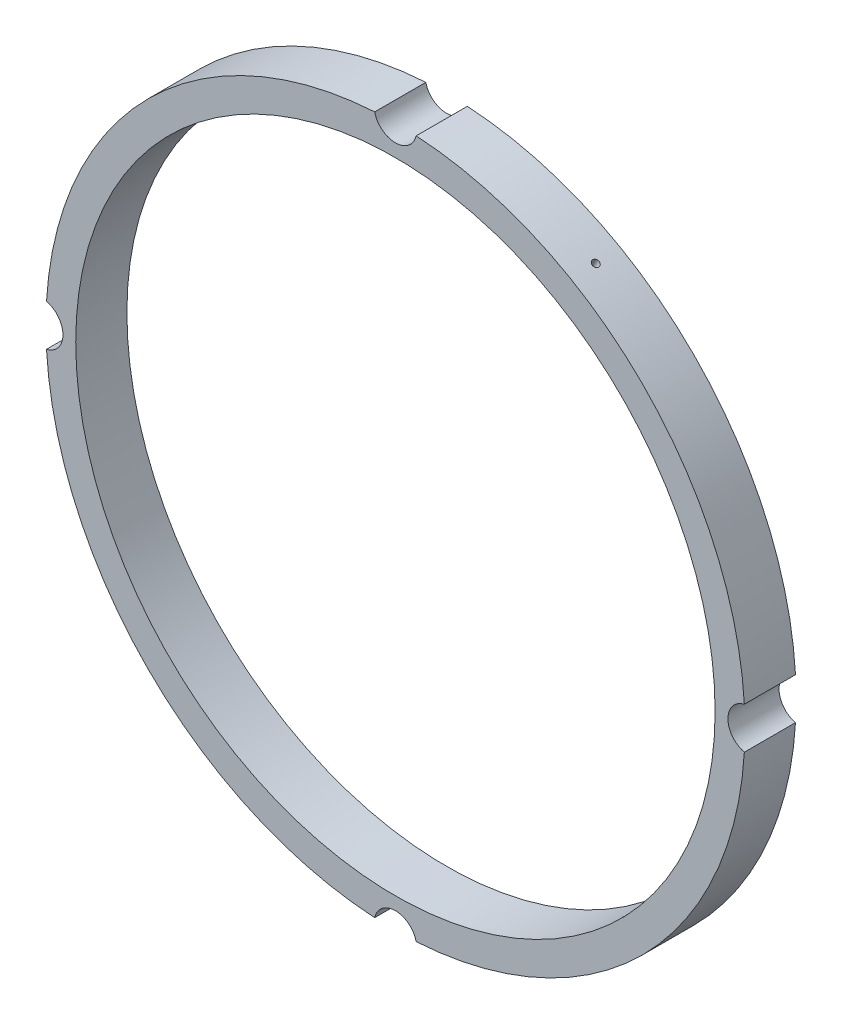
ISO-10303-21;
HEADER;
FILE_DESCRIPTION(('STEP AP214'),'2;1');
FILE_NAME('part.step','',(''),(''),'','','');
FILE_SCHEMA(('AUTOMOTIVE_DESIGN { 1 0 10303 214 1 1 1 1 }'));
ENDSEC;
DATA;
#1=APPLICATION_CONTEXT('core data for automotive mechanical design processes');
#2=APPLICATION_PROTOCOL_DEFINITION('international standard','automotive_design',2000,#1);
#3=PRODUCT_CONTEXT('',#1,'mechanical');
#4=PRODUCT('Part','Part','',(#3));
#5=PRODUCT_RELATED_PRODUCT_CATEGORY('part','',(#4));
#6=PRODUCT_DEFINITION_FORMATION('','',#4);
#7=PRODUCT_DEFINITION_CONTEXT('part definition',#1,'design');
#8=PRODUCT_DEFINITION('design','',#6,#7);
#9=PRODUCT_DEFINITION_SHAPE('','',#8);
#10=(LENGTH_UNIT() NAMED_UNIT(*) SI_UNIT(.MILLI.,.METRE.));
#11=(NAMED_UNIT(*) PLANE_ANGLE_UNIT() SI_UNIT($,.RADIAN.));
#12=(NAMED_UNIT(*) SI_UNIT($,.STERADIAN.) SOLID_ANGLE_UNIT());
#13=UNCERTAINTY_MEASURE_WITH_UNIT(LENGTH_MEASURE(1.E-05),#10,'distance_accuracy_value','');
#14=(GEOMETRIC_REPRESENTATION_CONTEXT(3) GLOBAL_UNCERTAINTY_ASSIGNED_CONTEXT((#13)) GLOBAL_UNIT_ASSIGNED_CONTEXT((#10,
#11,#12)) REPRESENTATION_CONTEXT('',''));
#15=CARTESIAN_POINT('',(0.,0.,0.));
#16=DIRECTION('',(0.,0.,1.));
#17=DIRECTION('',(1.,0.,0.));
#18=AXIS2_PLACEMENT_3D('',#15,#16,#17);
#19=CARTESIAN_POINT('',(0.,0.,12.));
#20=DIRECTION('',(0.,0.,-1.));
#21=DIRECTION('',(-1.,0.,0.));
#22=AXIS2_PLACEMENT_3D('',#19,#20,#21);
#23=CYLINDRICAL_SURFACE('',#22,82.);
#24=CARTESIAN_POINT('',(0.,0.,0.));
#25=DIRECTION('',(0.,0.,1.));
#26=DIRECTION('',(1.,0.,0.));
#27=AXIS2_PLACEMENT_3D('',#24,#25,#26);
#28=CIRCLE('',#27,82.);
#29=CARTESIAN_POINT('',(-4.86723129559619,81.855421686747,0.));
#30=VERTEX_POINT('',#29);
#31=CARTESIAN_POINT('',(-81.8554216867469,4.86723129559705,0.));
#32=VERTEX_POINT('',#31);
#33=EDGE_CURVE('E123',#30,#32,#28,.T.);
#34=ORIENTED_EDGE('',*,*,#33,.T.);
#35=DIRECTION('',(0.,0.,1.));
#36=VECTOR('',#35,1.);
#37=CARTESIAN_POINT('',(-81.8554216867469,4.86723129559704,6.));
#38=LINE('',#37,#36);
#39=CARTESIAN_POINT('',(-81.8554216867469,4.86723129559704,12.));
#40=VERTEX_POINT('',#39);
#41=EDGE_CURVE('E56',#32,#40,#38,.T.);
#42=ORIENTED_EDGE('',*,*,#41,.T.);
#43=CARTESIAN_POINT('',(0.,0.,12.));
#44=DIRECTION('',(0.,0.,1.));
#45=DIRECTION('',(1.,0.,0.));
#46=AXIS2_PLACEMENT_3D('',#43,#44,#45);
#47=CIRCLE('',#46,82.);
#48=CARTESIAN_POINT('',(-4.86723129559619,81.855421686747,12.));
#49=VERTEX_POINT('',#48);
#50=EDGE_CURVE('E130',#49,#40,#47,.T.);
#51=ORIENTED_EDGE('',*,*,#50,.F.);
#52=DIRECTION('',(0.,0.,1.));
#53=VECTOR('',#52,1.);
#54=CARTESIAN_POINT('',(-4.86723129559619,81.855421686747,6.));
#55=LINE('',#54,#53);
#56=EDGE_CURVE('E132',#49,#30,#55,.F.);
#57=ORIENTED_EDGE('',*,*,#56,.T.);
#58=EDGE_LOOP('',(#34,#42,#51,#57));
#59=FACE_BOUND('',#58,.T.);
#60=ADVANCED_FACE('F37',(#59),#23,.T.);
#61=CARTESIAN_POINT('',(-81.8554216867471,-4.86723129559533,12.));
#62=VERTEX_POINT('',#61);
#63=CARTESIAN_POINT('',(-4.86723129559619,-81.855421686747,12.));
#64=VERTEX_POINT('',#63);
#65=EDGE_CURVE('E116',#62,#64,#47,.T.);
#66=ORIENTED_EDGE('',*,*,#65,.F.);
#67=DIRECTION('',(0.,0.,1.));
#68=VECTOR('',#67,1.);
#69=CARTESIAN_POINT('',(-81.8554216867471,-4.86723129559533,6.));
#70=LINE('',#69,#68);
#71=CARTESIAN_POINT('',(-81.8554216867471,-4.86723129559533,0.));
#72=VERTEX_POINT('',#71);
#73=EDGE_CURVE('E107',#62,#72,#70,.F.);
#74=ORIENTED_EDGE('',*,*,#73,.T.);
#75=CARTESIAN_POINT('',(-4.86723129559619,-81.855421686747,0.));
#76=VERTEX_POINT('',#75);
#77=EDGE_CURVE('E64',#72,#76,#28,.T.);
#78=ORIENTED_EDGE('',*,*,#77,.T.);
#79=DIRECTION('',(0.,0.,1.));
#80=VECTOR('',#79,1.);
#81=CARTESIAN_POINT('',(-4.86723129559619,-81.855421686747,6.));
#82=LINE('',#81,#80);
#83=EDGE_CURVE('E161',#76,#64,#82,.T.);
#84=ORIENTED_EDGE('',*,*,#83,.T.);
#85=EDGE_LOOP('',(#66,#74,#78,#84));
#86=FACE_BOUND('',#85,.T.);
#87=ADVANCED_FACE('F115',(#86),#23,.T.);
#88=CARTESIAN_POINT('',(4.86723129559619,-81.855421686747,12.));
#89=VERTEX_POINT('',#88);
#90=CARTESIAN_POINT('',(81.855421686747,-4.86723129559647,12.));
#91=VERTEX_POINT('',#90);
#92=EDGE_CURVE('E146',#89,#91,#47,.T.);
#93=ORIENTED_EDGE('',*,*,#92,.F.);
#94=DIRECTION('',(0.,0.,1.));
#95=VECTOR('',#94,1.);
#96=CARTESIAN_POINT('',(4.86723129559619,-81.855421686747,6.));
#97=LINE('',#96,#95);
#98=CARTESIAN_POINT('',(4.86723129559619,-81.855421686747,0.));
#99=VERTEX_POINT('',#98);
#100=EDGE_CURVE('E214',#89,#99,#97,.F.);
#101=ORIENTED_EDGE('',*,*,#100,.T.);
#102=CARTESIAN_POINT('',(81.855421686747,-4.86723129559647,0.));
#103=VERTEX_POINT('',#102);
#104=EDGE_CURVE('E124',#99,#103,#28,.T.);
#105=ORIENTED_EDGE('',*,*,#104,.T.);
#106=DIRECTION('',(0.,0.,1.));
#107=VECTOR('',#106,1.);
#108=CARTESIAN_POINT('',(81.855421686747,-4.86723129559647,6.));
#109=LINE('',#108,#107);
#110=EDGE_CURVE('E49',#103,#91,#109,.T.);
#111=ORIENTED_EDGE('',*,*,#110,.T.);
#112=EDGE_LOOP('',(#93,#101,#105,#111));
#113=FACE_BOUND('',#112,.T.);
#114=ADVANCED_FACE('F144',(#113),#23,.T.);
#115=CARTESIAN_POINT('',(0.,0.,12.));
#116=DIRECTION('',(0.,0.,1.));
#117=DIRECTION('',(1.,0.,0.));
#118=AXIS2_PLACEMENT_3D('',#115,#116,#117);
#119=PLANE('',#118);
#120=CARTESIAN_POINT('',(-83.,8.6937885337194E-13,12.));
#121=DIRECTION('',(0.,0.,1.));
#122=DIRECTION('',(0.,1.,0.));
#123=AXIS2_PLACEMENT_3D('',#120,#121,#122);
#124=CIRCLE('',#123,5.);
#125=EDGE_CURVE('E112',#62,#40,#124,.T.);
#126=ORIENTED_EDGE('',*,*,#125,.F.);
#127=ORIENTED_EDGE('',*,*,#65,.T.);
#128=CARTESIAN_POINT('',(0.,-83.,12.));
#129=DIRECTION('',(0.,0.,1.));
#130=DIRECTION('',(-1.,0.,0.));
#131=AXIS2_PLACEMENT_3D('',#128,#129,#130);
#132=CIRCLE('',#131,5.);
#133=EDGE_CURVE('E206',#89,#64,#132,.T.);
#134=ORIENTED_EDGE('',*,*,#133,.F.);
#135=ORIENTED_EDGE('',*,*,#92,.T.);
#136=CARTESIAN_POINT('',(83.,-2.8979295112398E-13,12.));
#137=DIRECTION('',(0.,0.,1.));
#138=DIRECTION('',(0.,-1.,0.));
#139=AXIS2_PLACEMENT_3D('',#136,#137,#138);
#140=CIRCLE('',#139,5.);
#141=CARTESIAN_POINT('',(81.855421686747,4.8672312955959,12.));
#142=VERTEX_POINT('',#141);
#143=EDGE_CURVE('E153',#142,#91,#140,.T.);
#144=ORIENTED_EDGE('',*,*,#143,.F.);
#145=CARTESIAN_POINT('',(4.86723129559619,81.855421686747,12.));
#146=VERTEX_POINT('',#145);
#147=EDGE_CURVE('E126',#142,#146,#47,.T.);
#148=ORIENTED_EDGE('',*,*,#147,.T.);
#149=CARTESIAN_POINT('',(0.,83.,12.));
#150=DIRECTION('',(0.,0.,1.));
#151=DIRECTION('',(1.,0.,0.));
#152=AXIS2_PLACEMENT_3D('',#149,#150,#151);
#153=CIRCLE('',#152,5.);
#154=EDGE_CURVE('E156',#49,#146,#153,.T.);
#155=ORIENTED_EDGE('',*,*,#154,.F.);
#156=ORIENTED_EDGE('',*,*,#50,.T.);
#157=EDGE_LOOP('',(#126,#127,#134,#135,#144,#148,#155,#156));
#158=FACE_BOUND('',#157,.T.);
#159=CARTESIAN_POINT('',(0.,0.,12.));
#160=DIRECTION('',(0.,0.,1.));
#161=DIRECTION('',(1.,0.,0.));
#162=AXIS2_PLACEMENT_3D('',#159,#160,#161);
#163=CIRCLE('',#162,75.);
#164=CARTESIAN_POINT('',(75.,0.,12.));
#165=VERTEX_POINT('',#164);
#166=EDGE_CURVE('E168',#165,#165,#163,.T.);
#167=ORIENTED_EDGE('',*,*,#166,.F.);
#168=EDGE_LOOP('',(#167));
#169=FACE_BOUND('',#168,.T.);
#170=ADVANCED_FACE('F202',(#158,#169),#119,.T.);
#171=CARTESIAN_POINT('',(0.,0.,0.));
#172=DIRECTION('',(0.,0.,1.));
#173=DIRECTION('',(1.,0.,0.));
#174=AXIS2_PLACEMENT_3D('',#171,#172,#173);
#175=PLANE('',#174);
#176=ORIENTED_EDGE('',*,*,#77,.F.);
#177=CARTESIAN_POINT('',(-83.,8.6937885337194E-13,0.));
#178=DIRECTION('',(0.,0.,1.));
#179=DIRECTION('',(0.,1.,0.));
#180=AXIS2_PLACEMENT_3D('',#177,#178,#179);
#181=CIRCLE('',#180,5.);
#182=EDGE_CURVE('E105',#72,#32,#181,.T.);
#183=ORIENTED_EDGE('',*,*,#182,.T.);
#184=ORIENTED_EDGE('',*,*,#33,.F.);
#185=CARTESIAN_POINT('',(0.,83.,0.));
#186=DIRECTION('',(0.,0.,1.));
#187=DIRECTION('',(1.,0.,0.));
#188=AXIS2_PLACEMENT_3D('',#185,#186,#187);
#189=CIRCLE('',#188,5.);
#190=CARTESIAN_POINT('',(4.86723129559619,81.855421686747,0.));
#191=VERTEX_POINT('',#190);
#192=EDGE_CURVE('E159',#30,#191,#189,.T.);
#193=ORIENTED_EDGE('',*,*,#192,.T.);
#194=CARTESIAN_POINT('',(81.855421686747,4.8672312955959,0.));
#195=VERTEX_POINT('',#194);
#196=EDGE_CURVE('E127',#195,#191,#28,.T.);
#197=ORIENTED_EDGE('',*,*,#196,.F.);
#198=CARTESIAN_POINT('',(83.,-2.8979295112398E-13,0.));
#199=DIRECTION('',(0.,0.,1.));
#200=DIRECTION('',(0.,-1.,0.));
#201=AXIS2_PLACEMENT_3D('',#198,#199,#200);
#202=CIRCLE('',#201,5.);
#203=EDGE_CURVE('E151',#195,#103,#202,.T.);
#204=ORIENTED_EDGE('',*,*,#203,.T.);
#205=ORIENTED_EDGE('',*,*,#104,.F.);
#206=CARTESIAN_POINT('',(0.,-83.,0.));
#207=DIRECTION('',(0.,0.,1.));
#208=DIRECTION('',(-1.,0.,0.));
#209=AXIS2_PLACEMENT_3D('',#206,#207,#208);
#210=CIRCLE('',#209,5.);
#211=EDGE_CURVE('E122',#99,#76,#210,.T.);
#212=ORIENTED_EDGE('',*,*,#211,.T.);
#213=EDGE_LOOP('',(#176,#183,#184,#193,#197,#204,#205,#212));
#214=FACE_BOUND('',#213,.T.);
#215=CARTESIAN_POINT('',(0.,0.,0.));
#216=DIRECTION('',(0.,0.,1.));
#217=DIRECTION('',(1.,0.,0.));
#218=AXIS2_PLACEMENT_3D('',#215,#216,#217);
#219=CIRCLE('',#218,75.);
#220=CARTESIAN_POINT('',(75.,0.,0.));
#221=VERTEX_POINT('',#220);
#222=EDGE_CURVE('E166',#221,#221,#219,.T.);
#223=ORIENTED_EDGE('',*,*,#222,.T.);
#224=EDGE_LOOP('',(#223));
#225=FACE_BOUND('',#224,.T.);
#226=ADVANCED_FACE('F119',(#214,#225),#175,.F.);
#227=CARTESIAN_POINT('',(40.3052284110281,71.4107034185693,6.));
#228=CARTESIAN_POINT('',(40.305230162785,71.4107024681233,5.95506479609301));
#229=CARTESIAN_POINT('',(40.3085368078791,71.40883642493,5.91009703714875));
#230=CARTESIAN_POINT('',(40.3216802135916,71.4014156688339,5.82140003350558));
#231=CARTESIAN_POINT('',(40.3315248278901,71.3958565196163,5.7776723443821));
#232=CARTESIAN_POINT('',(40.3574592527584,71.3811999286591,5.69275330768963));
#233=CARTESIAN_POINT('',(40.3735460727166,71.3721041812829,5.65156075648079));
#234=CARTESIAN_POINT('',(40.4114971299767,71.3506227921757,5.57287429083479));
#235=CARTESIAN_POINT('',(40.4333599334488,71.3382379669211,5.53537946164327));
#236=CARTESIAN_POINT('',(40.4822388609424,71.3105120161913,5.4651344354136));
#237=CARTESIAN_POINT('',(40.5092556770344,71.2951704936937,5.43238487660122));
#238=CARTESIAN_POINT('',(40.5676657214676,71.2619507473826,5.37256517048709));
#239=CARTESIAN_POINT('',(40.59905912185,71.2440724238483,5.34549524655357));
#240=CARTESIAN_POINT('',(40.6653214679689,71.2062713712898,5.29780471692709));
#241=CARTESIAN_POINT('',(40.7001904182244,71.1863486396075,5.27718411961991));
#242=CARTESIAN_POINT('',(40.772406334745,71.1450111456782,5.24297779787522));
#243=CARTESIAN_POINT('',(40.8097532955037,71.1235963867468,5.22939205780614));
#244=CARTESIAN_POINT('',(40.8858585322044,71.0798740635081,5.20964144378451));
#245=CARTESIAN_POINT('',(40.9246167652487,71.0575665263361,5.20347634446412));
#246=CARTESIAN_POINT('',(41.0024427076472,71.0126869615936,5.19874133559804));
#247=CARTESIAN_POINT('',(41.0415104163721,70.9901149345609,5.20017141060814));
#248=CARTESIAN_POINT('',(41.1188455717403,70.945348935138,5.21058592631372));
#249=CARTESIAN_POINT('',(41.1571130452983,70.9231549500377,5.21957011251892));
#250=CARTESIAN_POINT('',(41.2317665366884,70.8797805669154,5.2448374350582));
#251=CARTESIAN_POINT('',(41.2681525523058,70.8586001700864,5.26112057998316));
#252=CARTESIAN_POINT('',(41.3380172194721,70.8178647619419,5.30052388209611));
#253=CARTESIAN_POINT('',(41.3714958216182,70.7983097782456,5.32364415543103));
#254=CARTESIAN_POINT('',(41.434603016724,70.7613949232539,5.37606530348475));
#255=CARTESIAN_POINT('',(41.4642316101463,70.7440350516948,5.40536617746084));
#256=CARTESIAN_POINT('',(41.5188083007378,70.7120185025764,5.4693182281911));
#257=CARTESIAN_POINT('',(41.5437562021976,70.6973619380483,5.50396962855131));
#258=CARTESIAN_POINT('',(41.5882710512857,70.6711849340483,5.57763829735254));
#259=CARTESIAN_POINT('',(41.6078379981956,70.6596644949952,5.61665556637643));
#260=CARTESIAN_POINT('',(41.641043626485,70.640100926749,5.69794850712354));
#261=CARTESIAN_POINT('',(41.6546823022913,70.6320578008251,5.74022418191001));
#262=CARTESIAN_POINT('',(41.6756502729947,70.6196879331484,5.8268337992777));
#263=CARTESIAN_POINT('',(41.6829795699621,70.6153611901761,5.87116774118355));
#264=CARTESIAN_POINT('',(41.6911239668386,70.6105530728755,5.96063342804992));
#265=CARTESIAN_POINT('',(41.6919393353669,70.6100715399797,6.00576514003536));
#266=CARTESIAN_POINT('',(41.6870338226723,70.6129677812092,6.09554693556317));
#267=CARTESIAN_POINT('',(41.6813129419862,70.6163455550177,6.14019701914508));
#268=CARTESIAN_POINT('',(41.6634948178797,70.6268596602105,6.22774720890134));
#269=CARTESIAN_POINT('',(41.6513976958952,70.6339959200141,6.27064734838672));
#270=CARTESIAN_POINT('',(41.6211650638207,70.6518147314161,6.3534808607507));
#271=CARTESIAN_POINT('',(41.6030295531477,70.6624972833568,6.39341423334282));
#272=CARTESIAN_POINT('',(41.5612265203059,70.6870924286367,6.469182062557));
#273=CARTESIAN_POINT('',(41.537558817141,70.7010051276562,6.50501638501377));
#274=CARTESIAN_POINT('',(41.4853544455829,70.7316497769729,6.57156755198845));
#275=CARTESIAN_POINT('',(41.4568177741148,70.7483817290505,6.60228439327472));
#276=CARTESIAN_POINT('',(41.3956750206665,70.7841743762166,6.65772966893016));
#277=CARTESIAN_POINT('',(41.3630688010143,70.8032351500882,6.68245790062276));
#278=CARTESIAN_POINT('',(41.2947046718655,70.8431290267123,6.72522259144113));
#279=CARTESIAN_POINT('',(41.2589467660966,70.8639621273686,6.74325905848161));
#280=CARTESIAN_POINT('',(41.1852880913143,70.9067969831621,6.77212789441348));
#281=CARTESIAN_POINT('',(41.1473873619883,70.9287987166545,6.7829603966825));
#282=CARTESIAN_POINT('',(41.0705139344065,70.9733390629306,6.79711425167829));
#283=CARTESIAN_POINT('',(41.0315412345227,70.9958776765296,6.80043559299621));
#284=CARTESIAN_POINT('',(40.9536306752187,71.0408485140235,6.79947279646204));
#285=CARTESIAN_POINT('',(40.9146928143604,71.0632807424909,6.7951889885238));
#286=CARTESIAN_POINT('',(40.8379572703114,71.1074061241529,6.779138152379));
#287=CARTESIAN_POINT('',(40.8001595894107,71.129099275863,6.76737110914375));
#288=CARTESIAN_POINT('',(40.7267814451327,71.1711392536284,6.73668763250792));
#289=CARTESIAN_POINT('',(40.6912010228659,71.1914860547211,6.71777106659268));
#290=CARTESIAN_POINT('',(40.6232765406942,71.2302669838026,6.67332635454546));
#291=CARTESIAN_POINT('',(40.5909323548439,71.2487011862253,6.6477984658466));
#292=CARTESIAN_POINT('',(40.5304074104666,71.2831487094411,6.59085755066491));
#293=CARTESIAN_POINT('',(40.5022263893502,71.2991621829217,6.55944489564428));
#294=CARTESIAN_POINT('',(40.4508278504761,71.328335198352,6.49161477008843));
#295=CARTESIAN_POINT('',(40.4276115676375,71.3414940302556,6.45519605804873));
#296=CARTESIAN_POINT('',(40.3868099222115,71.3646000206399,6.37838044791628));
#297=CARTESIAN_POINT('',(40.3692273551643,71.3745455846659,6.33798158776967));
#298=CARTESIAN_POINT('',(40.340231691055,71.3909377104108,6.25439747070503));
#299=CARTESIAN_POINT('',(40.3288112020707,71.3973884644812,6.21121562216788));
#300=CARTESIAN_POINT('',(40.3155112248783,71.4048988976244,6.13979902324665));
#301=CARTESIAN_POINT('',(40.3116600520628,71.4070729879977,6.11202827082364));
#302=CARTESIAN_POINT('',(40.3065180975612,71.4099755455663,6.05617592082972));
#303=CARTESIAN_POINT('',(40.3052273157971,71.4107040128057,6.02809432326828));
#304=CARTESIAN_POINT('',(40.3052284110281,71.4107034185693,6.));
#305=B_SPLINE_CURVE_WITH_KNOTS('',3,(#227,#228,#229,#230,#231,#232,#233,#234,#235,#236,#237,
#238,#239,#240,#241,#242,#243,#244,#245,#246,#247,#248,#249,#250,#251,#252,#253,#254,#255,#256,
#257,#258,#259,#260,#261,#262,#263,#264,#265,#266,#267,#268,#269,#270,#271,#272,#273,#274,#275,
#276,#277,#278,#279,#280,#281,#282,#283,#284,#285,#286,#287,#288,#289,#290,#291,#292,#293,#294,
#295,#296,#297,#298,#299,#300,#301,#302,#303,#304),.UNSPECIFIED.,.T.,.F.,(4,2,2,2,2,2,2,2,2,2,2,
2,2,2,2,2,2,2,2,2,2,2,2,2,2,2,2,2,2,2,2,2,2,2,2,2,2,2,4),(0.,0.134703067123951,
0.269568238553242,0.404368876326957,0.539136082591843,0.673921397882172,0.808712013005293,
0.943502803389999,1.07829329426615,1.21307969139774,1.3478658144514,1.4826473968801,
1.61742913794745,1.75221316877516,1.88699718340582,2.02178683237555,2.15657649934034,
2.29136629302324,2.426156042478,2.56094023348925,2.69572441343266,2.83050602649563,
2.96528765257389,3.10007368890393,3.23485981034963,3.36965049281603,3.50444101585779,
3.639229043254,3.77401727538222,3.90879966049609,4.04358231629638,4.1783674703827,
4.31314737696436,4.44791877874285,4.58272366439784,4.71759533917825,4.85230486249334,
4.93652372208243,5.02074257910246),.UNSPECIFIED.);
#306=CARTESIAN_POINT('',(40.3052284110281,71.4107034185693,6.));
#307=VERTEX_POINT('',#306);
#308=EDGE_CURVE('E11',#307,#307,#305,.T.);
#309=ORIENTED_EDGE('',*,*,#308,.T.);
#310=EDGE_LOOP('',(#309));
#311=FACE_BOUND('',#310,.T.);
#312=ORIENTED_EDGE('',*,*,#147,.F.);
#313=DIRECTION('',(0.,0.,1.));
#314=VECTOR('',#313,1.);
#315=CARTESIAN_POINT('',(81.855421686747,4.8672312955959,6.));
#316=LINE('',#315,#314);
#317=EDGE_CURVE('E138',#142,#195,#316,.F.);
#318=ORIENTED_EDGE('',*,*,#317,.T.);
#319=ORIENTED_EDGE('',*,*,#196,.T.);
#320=DIRECTION('',(0.,0.,1.));
#321=VECTOR('',#320,1.);
#322=CARTESIAN_POINT('',(4.86723129559619,81.855421686747,6.));
#323=LINE('',#322,#321);
#324=EDGE_CURVE('E135',#191,#146,#323,.T.);
#325=ORIENTED_EDGE('',*,*,#324,.T.);
#326=EDGE_LOOP('',(#312,#318,#319,#325));
#327=FACE_BOUND('',#326,.T.);
#328=ADVANCED_FACE('F39',(#311,#327),#23,.T.);
#329=CARTESIAN_POINT('',(0.,0.,12.));
#330=DIRECTION('',(0.,0.,-1.));
#331=DIRECTION('',(-1.,0.,0.));
#332=AXIS2_PLACEMENT_3D('',#329,#330,#331);
#333=CYLINDRICAL_SURFACE('',#332,75.);
#334=CARTESIAN_POINT('',(36.8050462829542,65.3482101370007,6.));
#335=CARTESIAN_POINT('',(36.8050480371068,65.3482091908556,5.9550650202504));
#336=CARTESIAN_POINT('',(36.8083563893281,65.3463461799556,5.91009749094246));
#337=CARTESIAN_POINT('',(36.8215064307599,65.3389372344705,5.82140095562176));
#338=CARTESIAN_POINT('',(36.8313559762903,65.3333868711768,5.77767350494019));
#339=CARTESIAN_POINT('',(36.8573029001601,65.3187526175866,5.69275494634586));
#340=CARTESIAN_POINT('',(36.8733972851322,65.3096704202157,5.65156263419737));
#341=CARTESIAN_POINT('',(36.9113652327449,65.2882193796654,5.57287659923403));
#342=CARTESIAN_POINT('',(36.9332373616623,65.275851351847,5.535381962022));
#343=CARTESIAN_POINT('',(36.9821357786632,65.2481602840425,5.46513702906338));
#344=CARTESIAN_POINT('',(37.0091627888349,65.2328368300614,5.43238739912278));
#345=CARTESIAN_POINT('',(37.0675928290538,65.1996525164563,5.37256749931847));
#346=CARTESIAN_POINT('',(37.0989960311762,65.1817915570551,5.34549745288538));
#347=CARTESIAN_POINT('',(37.165276621277,65.1440224914367,5.29780653018475));
#348=CARTESIAN_POINT('',(37.2001540272983,65.1241143745878,5.27718568741294));
#349=CARTESIAN_POINT('',(37.2723844475244,65.0828017747338,5.24297889347224));
#350=CARTESIAN_POINT('',(37.309737456126,65.0613972951156,5.22939292638149));
#351=CARTESIAN_POINT('',(37.3858514560471,65.0176901750221,5.20964196631049));
#352=CARTESIAN_POINT('',(37.4246123956757,64.9953875675174,5.20347670116969));
#353=CARTESIAN_POINT('',(37.5024403148383,64.9505118372576,5.19874132894007));
#354=CARTESIAN_POINT('',(37.541507293736,64.9279387150649,5.20017120606366));
#355=CARTESIAN_POINT('',(37.6188373554943,64.8831647861721,5.21058526118988));
#356=CARTESIAN_POINT('',(37.6571004707224,64.8609639644887,5.21956913443268));
#357=CARTESIAN_POINT('',(37.7317423544195,64.8175707954564,5.24483569725782));
#358=CARTESIAN_POINT('',(37.7681211206258,64.7963784493184,5.26111839560382));
#359=CARTESIAN_POINT('',(37.8379693340923,64.7556153066755,5.3005207415664));
#360=CARTESIAN_POINT('',(37.8714387220741,64.7360445432105,5.32364052844561));
#361=CARTESIAN_POINT('',(37.934526459754,64.6990961367939,5.3760606377374));
#362=CARTESIAN_POINT('',(37.9641448097006,64.6817184937006,5.40536095975093));
#363=CARTESIAN_POINT('',(38.0187013917973,64.6496662631315,5.46931214094039));
#364=CARTESIAN_POINT('',(38.0436393901331,64.6349918106984,5.50396326726653));
#365=CARTESIAN_POINT('',(38.0881356631969,64.6087810653332,5.57763147675293));
#366=CARTESIAN_POINT('',(38.1076939372037,64.597244772822,5.61664856049857));
#367=CARTESIAN_POINT('',(38.1408844541449,64.5776533045459,5.69794124937334));
#368=CARTESIAN_POINT('',(38.1545166903564,64.5695981327303,5.74021685819908));
#369=CARTESIAN_POINT('',(38.1754747513236,64.5572093338679,5.82682645392058));
#370=CARTESIAN_POINT('',(38.1828005784973,64.5528757053942,5.87116044002704));
#371=CARTESIAN_POINT('',(38.1909413824111,64.5480597632868,5.96062594210085));
#372=CARTESIAN_POINT('',(38.1917566800836,64.5475772598144,6.00575741864649));
#373=CARTESIAN_POINT('',(38.1868545475179,64.5504775161813,6.09553881341013));
#374=CARTESIAN_POINT('',(38.1811371179785,64.5538602756073,6.14018873167963));
#375=CARTESIAN_POINT('',(38.1633291083601,64.5643896994272,6.22773849669129));
#376=CARTESIAN_POINT('',(38.1512386734367,64.5715362780939,6.27063838326933));
#377=CARTESIAN_POINT('',(38.121021943817,64.58937987047,6.35347150366394));
#378=CARTESIAN_POINT('',(38.1028956482698,64.6000768846797,6.39340473706236));
#379=CARTESIAN_POINT('',(38.0611124544012,64.6247035165116,6.46917268708774));
#380=CARTESIAN_POINT('',(38.0374553396379,64.6386332606425,6.50500724323626));
#381=CARTESIAN_POINT('',(37.9852724588776,64.6693125821188,6.57155900623288));
#382=CARTESIAN_POINT('',(37.9567466895903,64.6860621613697,6.60227620962269));
#383=CARTESIAN_POINT('',(37.8956246465006,64.7218887639564,6.6577225312695));
#384=CARTESIAN_POINT('',(37.863028208343,64.7409658812668,6.6824514076266));
#385=CARTESIAN_POINT('',(37.7946816007971,64.7808892105927,6.72521742401462));
#386=CARTESIAN_POINT('',(37.7589314352171,64.8017354204719,6.7432545721263));
#387=CARTESIAN_POINT('',(37.6852854659991,64.8445917012878,6.77212471767835));
#388=CARTESIAN_POINT('',(37.6473897097049,64.8666017465431,6.78295787401225));
#389=CARTESIAN_POINT('',(37.570522798859,64.9111530416104,6.79711304961452));
#390=CARTESIAN_POINT('',(37.5315516427333,64.9336942922,6.80043505788946));
#391=CARTESIAN_POINT('',(37.4536409057876,64.9786642363913,6.79947358692461));
#392=CARTESIAN_POINT('',(37.4147013234452,65.0010929357281,6.79519049922343));
#393=CARTESIAN_POINT('',(37.3379589704716,65.0452056620496,6.77914120179627));
#394=CARTESIAN_POINT('',(37.3001562021231,65.0668896875391,6.76737497704568));
#395=CARTESIAN_POINT('',(37.2267650922114,65.1089068431069,6.73669322600969));
#396=CARTESIAN_POINT('',(37.1911767916611,65.1292399481661,6.71777756735918));
#397=CARTESIAN_POINT('',(37.1232346218809,65.1679904761977,6.67333473728467));
#398=CARTESIAN_POINT('',(37.0908806269882,65.1864079735984,6.64780782286669));
#399=CARTESIAN_POINT('',(37.0303349483126,65.2208211267837,6.59086865031062));
#400=CARTESIAN_POINT('',(37.0021430357465,65.236816915687,6.55945671587822));
#401=CARTESIAN_POINT('',(36.9507230753817,65.2659554454819,6.49162792346797));
#402=CARTESIAN_POINT('',(36.9274962624952,65.2790974766038,6.45520982405611));
#403=CARTESIAN_POINT('',(36.886674973326,65.3021727146869,6.37839515111328));
#404=CARTESIAN_POINT('',(36.8690833131314,65.3121043173042,6.3379966015531));
#405=CARTESIAN_POINT('',(36.8400719807352,65.3284729390554,6.25441290469288));
#406=CARTESIAN_POINT('',(36.8286449144051,65.3349141447912,6.21123116563503));
#407=CARTESIAN_POINT('',(36.8153363830033,65.3424137824977,6.13981210935176));
#408=CARTESIAN_POINT('',(36.8114824882576,65.3445848245014,6.11203879602761));
#409=CARTESIAN_POINT('',(36.8063368898609,65.3474832975298,6.05618123049377));
#410=CARTESIAN_POINT('',(36.8050451861163,65.3482107286071,6.02809697829541));
#411=CARTESIAN_POINT('',(36.8050462829542,65.3482101370007,6.));
#412=B_SPLINE_CURVE_WITH_KNOTS('',3,(#334,#335,#336,#337,#338,#339,#340,#341,#342,#343,#344,
#345,#346,#347,#348,#349,#350,#351,#352,#353,#354,#355,#356,#357,#358,#359,#360,#361,#362,#363,
#364,#365,#366,#367,#368,#369,#370,#371,#372,#373,#374,#375,#376,#377,#378,#379,#380,#381,#382,
#383,#384,#385,#386,#387,#388,#389,#390,#391,#392,#393,#394,#395,#396,#397,#398,#399,#400,#401,
#402,#403,#404,#405,#406,#407,#408,#409,#410,#411),.UNSPECIFIED.,.T.,.F.,(4,2,2,2,2,2,2,2,2,2,2,
2,2,2,2,2,2,2,2,2,2,2,2,2,2,2,2,2,2,2,2,2,2,2,2,2,2,2,4),(0.,0.134702384884244,
0.269566847771312,0.40436674516063,0.539133223883879,0.673918594382309,0.808709266243901,
0.943500638166865,1.07829170501872,1.21307782814302,1.34786367109515,1.48264407648283,
1.61742464370114,1.75220795641378,1.88699126042393,2.02178129595246,2.15657134955318,
2.29136155606753,2.42615171089689,2.56093522128892,2.69571871726381,2.83049914345483,
2.96527958864289,3.10006530918112,3.2348511208066,3.36964237622915,3.50443346888079,
3.63922158843893,3.77400990527479,3.9087912829084,4.04357293115624,4.17835707488293,
4.31313597979599,4.44790747336683,4.58271244820657,4.71758468521551,4.8522947878496,
4.93652160053771,5.02074841015293),.UNSPECIFIED.);
#413=CARTESIAN_POINT('',(36.8050462829542,65.3482101370007,6.));
#414=VERTEX_POINT('',#413);
#415=EDGE_CURVE('E207',#414,#414,#412,.T.);
#416=ORIENTED_EDGE('',*,*,#415,.F.);
#417=EDGE_LOOP('',(#416));
#418=FACE_BOUND('',#417,.T.);
#419=ORIENTED_EDGE('',*,*,#166,.T.);
#420=EDGE_LOOP('',(#419));
#421=FACE_BOUND('',#420,.T.);
#422=ORIENTED_EDGE('',*,*,#222,.F.);
#423=EDGE_LOOP('',(#422));
#424=FACE_BOUND('',#423,.T.);
#425=ADVANCED_FACE('F173',(#418,#421,#424),#333,.F.);
#426=CARTESIAN_POINT('',(0.,83.,0.));
#427=DIRECTION('',(0.,0.,1.));
#428=DIRECTION('',(1.,0.,0.));
#429=AXIS2_PLACEMENT_3D('',#426,#427,#428);
#430=CYLINDRICAL_SURFACE('',#429,5.);
#431=ORIENTED_EDGE('',*,*,#192,.F.);
#432=ORIENTED_EDGE('',*,*,#56,.F.);
#433=ORIENTED_EDGE('',*,*,#154,.T.);
#434=ORIENTED_EDGE('',*,*,#324,.F.);
#435=EDGE_LOOP('',(#431,#432,#433,#434));
#436=FACE_BOUND('',#435,.T.);
#437=ADVANCED_FACE('F175',(#436),#430,.F.);
#438=CARTESIAN_POINT('',(83.,-2.8979295112398E-13,0.));
#439=DIRECTION('',(0.,0.,1.));
#440=DIRECTION('',(1.,0.,0.));
#441=AXIS2_PLACEMENT_3D('',#438,#439,#440);
#442=CYLINDRICAL_SURFACE('',#441,5.);
#443=ORIENTED_EDGE('',*,*,#203,.F.);
#444=ORIENTED_EDGE('',*,*,#317,.F.);
#445=ORIENTED_EDGE('',*,*,#143,.T.);
#446=ORIENTED_EDGE('',*,*,#110,.F.);
#447=EDGE_LOOP('',(#443,#444,#445,#446));
#448=FACE_BOUND('',#447,.T.);
#449=ADVANCED_FACE('F150',(#448),#442,.F.);
#450=CARTESIAN_POINT('',(0.,-83.,0.));
#451=DIRECTION('',(0.,0.,1.));
#452=DIRECTION('',(1.,0.,0.));
#453=AXIS2_PLACEMENT_3D('',#450,#451,#452);
#454=CYLINDRICAL_SURFACE('',#453,5.);
#455=ORIENTED_EDGE('',*,*,#211,.F.);
#456=ORIENTED_EDGE('',*,*,#100,.F.);
#457=ORIENTED_EDGE('',*,*,#133,.T.);
#458=ORIENTED_EDGE('',*,*,#83,.F.);
#459=EDGE_LOOP('',(#455,#456,#457,#458));
#460=FACE_BOUND('',#459,.T.);
#461=ADVANCED_FACE('F216',(#460),#454,.F.);
#462=CARTESIAN_POINT('',(-83.,8.6937885337194E-13,0.));
#463=DIRECTION('',(0.,0.,1.));
#464=DIRECTION('',(1.,0.,0.));
#465=AXIS2_PLACEMENT_3D('',#462,#463,#464);
#466=CYLINDRICAL_SURFACE('',#465,5.);
#467=ORIENTED_EDGE('',*,*,#182,.F.);
#468=ORIENTED_EDGE('',*,*,#73,.F.);
#469=ORIENTED_EDGE('',*,*,#125,.T.);
#470=ORIENTED_EDGE('',*,*,#41,.F.);
#471=EDGE_LOOP('',(#467,#468,#469,#470));
#472=FACE_BOUND('',#471,.T.);
#473=ADVANCED_FACE('F106',(#472),#466,.F.);
#474=CARTESIAN_POINT('',(41.,71.014083110324,6.));
#475=DIRECTION('',(0.5,0.866025403784439,0.));
#476=DIRECTION('',(-0.866025403784439,0.5,0.));
#477=AXIS2_PLACEMENT_3D('',#474,#475,#476);
#478=CYLINDRICAL_SURFACE('',#477,0.799999999999989);
#479=ORIENTED_EDGE('',*,*,#415,.T.);
#480=EDGE_LOOP('',(#479));
#481=FACE_BOUND('',#480,.T.);
#482=ORIENTED_EDGE('',*,*,#308,.F.);
#483=EDGE_LOOP('',(#482));
#484=FACE_BOUND('',#483,.T.);
#485=ADVANCED_FACE('F223',(#481,#484),#478,.F.);
#486=CLOSED_SHELL('',(#60,#87,#114,#170,#226,#328,#425,#437,#449,#461,#473,#485));
#487=MANIFOLD_SOLID_BREP('B2',#486);
#488=ADVANCED_BREP_SHAPE_REPRESENTATION('',(#18,#487),#14);
#489=SHAPE_DEFINITION_REPRESENTATION(#9,#488);
ENDSEC;
END-ISO-10303-21;
